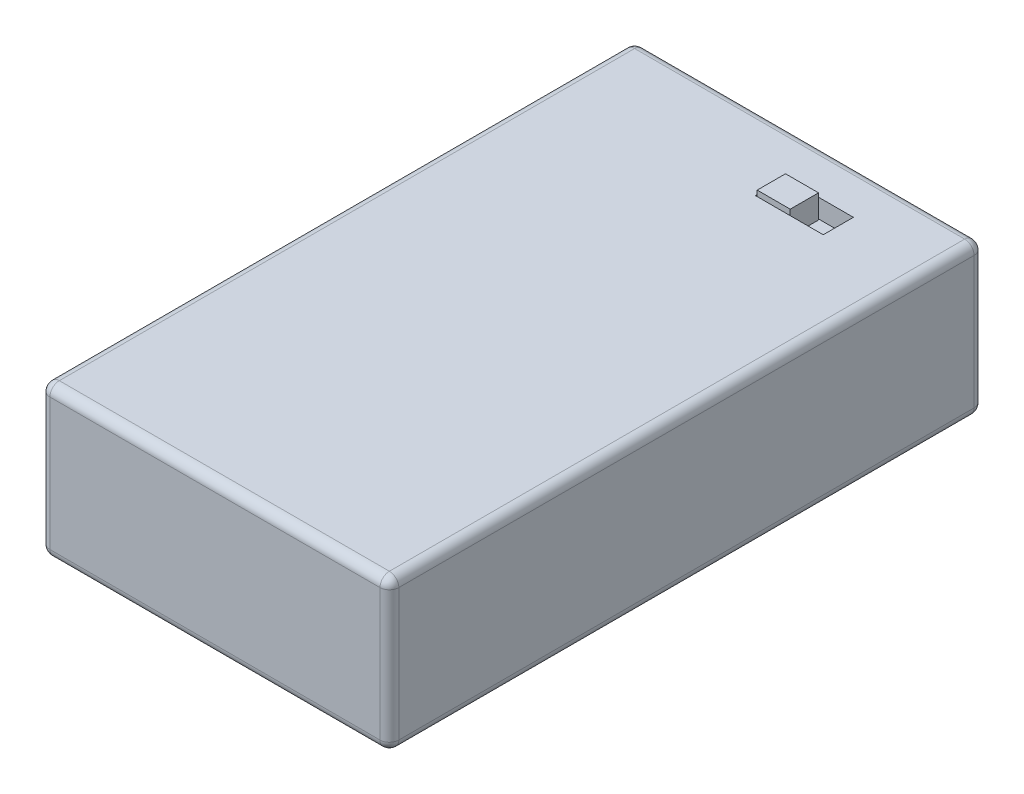
ISO-10303-21;
HEADER;
FILE_DESCRIPTION(('STEP AP214'),'2;1');
FILE_NAME('part.step','',(''),(''),'','','');
FILE_SCHEMA(('AUTOMOTIVE_DESIGN { 1 0 10303 214 1 1 1 1 }'));
ENDSEC;
DATA;
#1=APPLICATION_CONTEXT('core data for automotive mechanical design processes');
#2=APPLICATION_PROTOCOL_DEFINITION('international standard','automotive_design',2000,#1);
#3=PRODUCT_CONTEXT('',#1,'mechanical');
#4=PRODUCT('Part','Part','',(#3));
#5=PRODUCT_RELATED_PRODUCT_CATEGORY('part','',(#4));
#6=PRODUCT_DEFINITION_FORMATION('','',#4);
#7=PRODUCT_DEFINITION_CONTEXT('part definition',#1,'design');
#8=PRODUCT_DEFINITION('design','',#6,#7);
#9=PRODUCT_DEFINITION_SHAPE('','',#8);
#10=(LENGTH_UNIT() NAMED_UNIT(*) SI_UNIT(.MILLI.,.METRE.));
#11=(NAMED_UNIT(*) PLANE_ANGLE_UNIT() SI_UNIT($,.RADIAN.));
#12=(NAMED_UNIT(*) SI_UNIT($,.STERADIAN.) SOLID_ANGLE_UNIT());
#13=UNCERTAINTY_MEASURE_WITH_UNIT(LENGTH_MEASURE(1.E-05),#10,'distance_accuracy_value','');
#14=(GEOMETRIC_REPRESENTATION_CONTEXT(3) GLOBAL_UNCERTAINTY_ASSIGNED_CONTEXT((#13)) GLOBAL_UNIT_ASSIGNED_CONTEXT((#10,
#11,#12)) REPRESENTATION_CONTEXT('',''));
#15=CARTESIAN_POINT('',(0.,0.,0.));
#16=DIRECTION('',(0.,0.,1.));
#17=DIRECTION('',(1.,0.,0.));
#18=AXIS2_PLACEMENT_3D('',#15,#16,#17);
#19=CARTESIAN_POINT('',(-18.5,16.,31.5));
#20=DIRECTION('',(0.,0.,-1.));
#21=DIRECTION('',(-1.,0.,0.));
#22=AXIS2_PLACEMENT_3D('',#19,#20,#21);
#23=PLANE('',#22);
#24=DIRECTION('',(0.,-1.,0.));
#25=VECTOR('',#24,1.);
#26=CARTESIAN_POINT('',(17.5,16.,31.5));
#27=LINE('',#26,#25);
#28=CARTESIAN_POINT('',(17.5,1.,31.5));
#29=VERTEX_POINT('',#28);
#30=CARTESIAN_POINT('',(17.5,15.,31.5));
#31=VERTEX_POINT('',#30);
#32=EDGE_CURVE('E262',#29,#31,#27,.F.);
#33=ORIENTED_EDGE('',*,*,#32,.T.);
#34=DIRECTION('',(1.,0.,0.));
#35=VECTOR('',#34,1.);
#36=CARTESIAN_POINT('',(-18.5,15.,31.5));
#37=LINE('',#36,#35);
#38=CARTESIAN_POINT('',(-17.5,15.,31.5));
#39=VERTEX_POINT('',#38);
#40=EDGE_CURVE('E265',#31,#39,#37,.F.);
#41=ORIENTED_EDGE('',*,*,#40,.T.);
#42=DIRECTION('',(0.,-1.,0.));
#43=VECTOR('',#42,1.);
#44=CARTESIAN_POINT('',(-17.5,0.,31.5));
#45=LINE('',#44,#43);
#46=CARTESIAN_POINT('',(-17.5,1.,31.5));
#47=VERTEX_POINT('',#46);
#48=EDGE_CURVE('E260',#39,#47,#45,.T.);
#49=ORIENTED_EDGE('',*,*,#48,.T.);
#50=DIRECTION('',(1.,0.,0.));
#51=VECTOR('',#50,1.);
#52=CARTESIAN_POINT('',(-18.5,1.,31.5));
#53=LINE('',#52,#51);
#54=EDGE_CURVE('E258',#47,#29,#53,.T.);
#55=ORIENTED_EDGE('',*,*,#54,.T.);
#56=EDGE_LOOP('',(#33,#41,#49,#55));
#57=FACE_BOUND('',#56,.T.);
#58=ADVANCED_FACE('F35',(#57),#23,.F.);
#59=CARTESIAN_POINT('',(18.5,16.,31.5));
#60=DIRECTION('',(-1.,0.,0.));
#61=DIRECTION('',(0.,0.,1.));
#62=AXIS2_PLACEMENT_3D('',#59,#60,#61);
#63=PLANE('',#62);
#64=DIRECTION('',(0.,-1.,0.));
#65=VECTOR('',#64,1.);
#66=CARTESIAN_POINT('',(18.5,16.,30.5));
#67=LINE('',#66,#65);
#68=CARTESIAN_POINT('',(18.5,15.,30.5));
#69=VERTEX_POINT('',#68);
#70=CARTESIAN_POINT('',(18.5,1.,30.5));
#71=VERTEX_POINT('',#70);
#72=EDGE_CURVE('E251',#69,#71,#67,.T.);
#73=ORIENTED_EDGE('',*,*,#72,.T.);
#74=DIRECTION('',(0.,0.,-1.));
#75=VECTOR('',#74,1.);
#76=CARTESIAN_POINT('',(18.5,1.,31.5));
#77=LINE('',#76,#75);
#78=CARTESIAN_POINT('',(18.5,1.,-30.5));
#79=VERTEX_POINT('',#78);
#80=EDGE_CURVE('E256',#71,#79,#77,.T.);
#81=ORIENTED_EDGE('',*,*,#80,.T.);
#82=DIRECTION('',(0.,-1.,0.));
#83=VECTOR('',#82,1.);
#84=CARTESIAN_POINT('',(18.5,16.,-30.5));
#85=LINE('',#84,#83);
#86=CARTESIAN_POINT('',(18.5,15.,-30.5));
#87=VERTEX_POINT('',#86);
#88=EDGE_CURVE('E253',#79,#87,#85,.F.);
#89=ORIENTED_EDGE('',*,*,#88,.T.);
#90=DIRECTION('',(0.,0.,-1.));
#91=VECTOR('',#90,1.);
#92=CARTESIAN_POINT('',(18.5,15.,31.5));
#93=LINE('',#92,#91);
#94=EDGE_CURVE('E249',#87,#69,#93,.F.);
#95=ORIENTED_EDGE('',*,*,#94,.T.);
#96=EDGE_LOOP('',(#73,#81,#89,#95));
#97=FACE_BOUND('',#96,.T.);
#98=ADVANCED_FACE('F436',(#97),#63,.F.);
#99=CARTESIAN_POINT('',(-18.5,16.,-31.5));
#100=DIRECTION('',(0.,0.,-1.));
#101=DIRECTION('',(-1.,0.,0.));
#102=AXIS2_PLACEMENT_3D('',#99,#100,#101);
#103=PLANE('',#102);
#104=DIRECTION('',(0.,-1.,0.));
#105=VECTOR('',#104,1.);
#106=CARTESIAN_POINT('',(17.5,0.,-31.5));
#107=LINE('',#106,#105);
#108=CARTESIAN_POINT('',(17.5,15.,-31.5));
#109=VERTEX_POINT('',#108);
#110=CARTESIAN_POINT('',(17.5,1.,-31.5));
#111=VERTEX_POINT('',#110);
#112=EDGE_CURVE('E244',#109,#111,#107,.T.);
#113=ORIENTED_EDGE('',*,*,#112,.T.);
#114=DIRECTION('',(1.,0.,0.));
#115=VECTOR('',#114,1.);
#116=CARTESIAN_POINT('',(-18.5,1.,-31.5));
#117=LINE('',#116,#115);
#118=CARTESIAN_POINT('',(-17.5,1.,-31.5));
#119=VERTEX_POINT('',#118);
#120=EDGE_CURVE('E247',#111,#119,#117,.F.);
#121=ORIENTED_EDGE('',*,*,#120,.T.);
#122=DIRECTION('',(0.,-1.,0.));
#123=VECTOR('',#122,1.);
#124=CARTESIAN_POINT('',(-17.5,16.,-31.5));
#125=LINE('',#124,#123);
#126=CARTESIAN_POINT('',(-17.5,15.,-31.5));
#127=VERTEX_POINT('',#126);
#128=EDGE_CURVE('E242',#119,#127,#125,.F.);
#129=ORIENTED_EDGE('',*,*,#128,.T.);
#130=DIRECTION('',(1.,0.,0.));
#131=VECTOR('',#130,1.);
#132=CARTESIAN_POINT('',(-18.5,15.,-31.5));
#133=LINE('',#132,#131);
#134=EDGE_CURVE('E240',#127,#109,#133,.T.);
#135=ORIENTED_EDGE('',*,*,#134,.T.);
#136=EDGE_LOOP('',(#113,#121,#129,#135));
#137=FACE_BOUND('',#136,.T.);
#138=ADVANCED_FACE('F441',(#137),#103,.T.);
#139=CARTESIAN_POINT('',(-18.5,16.,31.5));
#140=DIRECTION('',(-1.,0.,0.));
#141=DIRECTION('',(0.,0.,1.));
#142=AXIS2_PLACEMENT_3D('',#139,#140,#141);
#143=PLANE('',#142);
#144=DIRECTION('',(0.,-1.,0.));
#145=VECTOR('',#144,1.);
#146=CARTESIAN_POINT('',(-18.5,16.,-30.5));
#147=LINE('',#146,#145);
#148=CARTESIAN_POINT('',(-18.5,15.,-30.5));
#149=VERTEX_POINT('',#148);
#150=CARTESIAN_POINT('',(-18.5,1.,-30.5));
#151=VERTEX_POINT('',#150);
#152=EDGE_CURVE('E271',#149,#151,#147,.T.);
#153=ORIENTED_EDGE('',*,*,#152,.T.);
#154=DIRECTION('',(0.,0.,-1.));
#155=VECTOR('',#154,1.);
#156=CARTESIAN_POINT('',(-18.5,1.,31.5));
#157=LINE('',#156,#155);
#158=CARTESIAN_POINT('',(-18.5,1.,30.5));
#159=VERTEX_POINT('',#158);
#160=EDGE_CURVE('E274',#151,#159,#157,.F.);
#161=ORIENTED_EDGE('',*,*,#160,.T.);
#162=DIRECTION('',(0.,-1.,0.));
#163=VECTOR('',#162,1.);
#164=CARTESIAN_POINT('',(-18.5,16.,30.5));
#165=LINE('',#164,#163);
#166=CARTESIAN_POINT('',(-18.5,15.,30.5));
#167=VERTEX_POINT('',#166);
#168=EDGE_CURVE('E269',#159,#167,#165,.F.);
#169=ORIENTED_EDGE('',*,*,#168,.T.);
#170=DIRECTION('',(0.,0.,-1.));
#171=VECTOR('',#170,1.);
#172=CARTESIAN_POINT('',(-18.5,15.,31.5));
#173=LINE('',#172,#171);
#174=EDGE_CURVE('E267',#167,#149,#173,.T.);
#175=ORIENTED_EDGE('',*,*,#174,.T.);
#176=EDGE_LOOP('',(#153,#161,#169,#175));
#177=FACE_BOUND('',#176,.T.);
#178=ADVANCED_FACE('F381',(#177),#143,.T.);
#179=CARTESIAN_POINT('',(0.,16.,0.));
#180=DIRECTION('',(0.,1.,0.));
#181=DIRECTION('',(0.,0.,1.));
#182=AXIS2_PLACEMENT_3D('',#179,#180,#181);
#183=PLANE('',#182);
#184=DIRECTION('',(0.,0.,-1.));
#185=VECTOR('',#184,1.);
#186=CARTESIAN_POINT('',(9.59999999999999,16.,0.));
#187=LINE('',#186,#185);
#188=CARTESIAN_POINT('',(9.59999999999999,16.,-23.4));
#189=VERTEX_POINT('',#188);
#190=CARTESIAN_POINT('',(9.59999999999999,16.,-26.6));
#191=VERTEX_POINT('',#190);
#192=EDGE_CURVE('E60',#189,#191,#187,.T.);
#193=ORIENTED_EDGE('',*,*,#192,.F.);
#194=DIRECTION('',(-1.,0.,0.));
#195=VECTOR('',#194,1.);
#196=CARTESIAN_POINT('',(0.,16.,-23.4));
#197=LINE('',#196,#195);
#198=CARTESIAN_POINT('',(2.4,16.,-23.4));
#199=VERTEX_POINT('',#198);
#200=EDGE_CURVE('E215',#189,#199,#197,.T.);
#201=ORIENTED_EDGE('',*,*,#200,.T.);
#202=DIRECTION('',(0.,0.,-1.));
#203=VECTOR('',#202,1.);
#204=CARTESIAN_POINT('',(2.4,16.,0.));
#205=LINE('',#204,#203);
#206=CARTESIAN_POINT('',(2.4,16.,-26.6));
#207=VERTEX_POINT('',#206);
#208=EDGE_CURVE('E227',#199,#207,#205,.T.);
#209=ORIENTED_EDGE('',*,*,#208,.T.);
#210=DIRECTION('',(-1.,0.,0.));
#211=VECTOR('',#210,1.);
#212=CARTESIAN_POINT('',(0.,16.,-26.6));
#213=LINE('',#212,#211);
#214=EDGE_CURVE('E224',#191,#207,#213,.T.);
#215=ORIENTED_EDGE('',*,*,#214,.F.);
#216=EDGE_LOOP('',(#193,#201,#209,#215));
#217=FACE_BOUND('',#216,.T.);
#218=DIRECTION('',(1.,0.,0.));
#219=VECTOR('',#218,1.);
#220=CARTESIAN_POINT('',(18.5,16.,30.5));
#221=LINE('',#220,#219);
#222=CARTESIAN_POINT('',(-17.5,16.,30.5));
#223=VERTEX_POINT('',#222);
#224=CARTESIAN_POINT('',(17.5,16.,30.5));
#225=VERTEX_POINT('',#224);
#226=EDGE_CURVE('E287',#223,#225,#221,.T.);
#227=ORIENTED_EDGE('',*,*,#226,.T.);
#228=DIRECTION('',(0.,0.,-1.));
#229=VECTOR('',#228,1.);
#230=CARTESIAN_POINT('',(17.5,16.,-31.5));
#231=LINE('',#230,#229);
#232=CARTESIAN_POINT('',(17.5,16.,-30.5));
#233=VERTEX_POINT('',#232);
#234=EDGE_CURVE('E11',#225,#233,#231,.T.);
#235=ORIENTED_EDGE('',*,*,#234,.T.);
#236=DIRECTION('',(1.,0.,0.));
#237=VECTOR('',#236,1.);
#238=CARTESIAN_POINT('',(0.,16.,-30.5));
#239=LINE('',#238,#237);
#240=CARTESIAN_POINT('',(-17.5,16.,-30.5));
#241=VERTEX_POINT('',#240);
#242=EDGE_CURVE('E44',#233,#241,#239,.F.);
#243=ORIENTED_EDGE('',*,*,#242,.T.);
#244=DIRECTION('',(0.,0.,-1.));
#245=VECTOR('',#244,1.);
#246=CARTESIAN_POINT('',(-17.5,16.,0.));
#247=LINE('',#246,#245);
#248=EDGE_CURVE('E285',#241,#223,#247,.F.);
#249=ORIENTED_EDGE('',*,*,#248,.T.);
#250=EDGE_LOOP('',(#227,#235,#243,#249));
#251=FACE_BOUND('',#250,.T.);
#252=ADVANCED_FACE('F372',(#217,#251),#183,.T.);
#253=CARTESIAN_POINT('',(0.,0.,0.));
#254=DIRECTION('',(0.,1.,0.));
#255=DIRECTION('',(0.,0.,1.));
#256=AXIS2_PLACEMENT_3D('',#253,#254,#255);
#257=PLANE('',#256);
#258=DIRECTION('',(1.,0.,0.));
#259=VECTOR('',#258,1.);
#260=CARTESIAN_POINT('',(18.5,0.,-30.5));
#261=LINE('',#260,#259);
#262=CARTESIAN_POINT('',(-17.5,0.,-30.5));
#263=VERTEX_POINT('',#262);
#264=CARTESIAN_POINT('',(17.5,0.,-30.5));
#265=VERTEX_POINT('',#264);
#266=EDGE_CURVE('E280',#263,#265,#261,.T.);
#267=ORIENTED_EDGE('',*,*,#266,.T.);
#268=DIRECTION('',(0.,0.,-1.));
#269=VECTOR('',#268,1.);
#270=CARTESIAN_POINT('',(17.5,0.,0.));
#271=LINE('',#270,#269);
#272=CARTESIAN_POINT('',(17.5,0.,30.5));
#273=VERTEX_POINT('',#272);
#274=EDGE_CURVE('E283',#265,#273,#271,.F.);
#275=ORIENTED_EDGE('',*,*,#274,.T.);
#276=DIRECTION('',(1.,0.,0.));
#277=VECTOR('',#276,1.);
#278=CARTESIAN_POINT('',(0.,0.,30.5));
#279=LINE('',#278,#277);
#280=CARTESIAN_POINT('',(-17.5,0.,30.5));
#281=VERTEX_POINT('',#280);
#282=EDGE_CURVE('E278',#273,#281,#279,.F.);
#283=ORIENTED_EDGE('',*,*,#282,.T.);
#284=DIRECTION('',(0.,0.,-1.));
#285=VECTOR('',#284,1.);
#286=CARTESIAN_POINT('',(-17.5,0.,-31.5));
#287=LINE('',#286,#285);
#288=EDGE_CURVE('E276',#281,#263,#287,.T.);
#289=ORIENTED_EDGE('',*,*,#288,.T.);
#290=EDGE_LOOP('',(#267,#275,#283,#289));
#291=FACE_BOUND('',#290,.T.);
#292=ADVANCED_FACE('F488',(#291),#257,.F.);
#293=CARTESIAN_POINT('',(-17.5,16.,30.5));
#294=DIRECTION('',(0.,1.,0.));
#295=DIRECTION('',(0.,0.,1.));
#296=AXIS2_PLACEMENT_3D('',#293,#294,#295);
#297=CYLINDRICAL_SURFACE('',#296,1.);
#298=CARTESIAN_POINT('',(-17.5,15.,30.5));
#299=DIRECTION('',(0.,1.,0.));
#300=DIRECTION('',(0.,0.,1.));
#301=AXIS2_PLACEMENT_3D('',#298,#299,#300);
#302=CIRCLE('',#301,1.);
#303=EDGE_CURVE('E39',#167,#39,#302,.T.);
#304=ORIENTED_EDGE('',*,*,#303,.F.);
#305=ORIENTED_EDGE('',*,*,#168,.F.);
#306=CARTESIAN_POINT('',(-17.5,1.,30.5));
#307=DIRECTION('',(0.,-1.,0.));
#308=DIRECTION('',(1.,0.,0.));
#309=AXIS2_PLACEMENT_3D('',#306,#307,#308);
#310=CIRCLE('',#309,1.);
#311=EDGE_CURVE('E349',#47,#159,#310,.T.);
#312=ORIENTED_EDGE('',*,*,#311,.F.);
#313=ORIENTED_EDGE('',*,*,#48,.F.);
#314=EDGE_LOOP('',(#304,#305,#312,#313));
#315=FACE_BOUND('',#314,.T.);
#316=ADVANCED_FACE('F37',(#315),#297,.T.);
#317=CARTESIAN_POINT('',(-17.5,15.,30.5));
#318=DIRECTION('',(0.,0.,1.));
#319=DIRECTION('',(1.,0.,0.));
#320=AXIS2_PLACEMENT_3D('',#317,#318,#319);
#321=SPHERICAL_SURFACE('',#320,1.);
#322=CARTESIAN_POINT('',(-17.5,15.,30.5));
#323=DIRECTION('',(0.,0.,1.));
#324=DIRECTION('',(1.,0.,0.));
#325=AXIS2_PLACEMENT_3D('',#322,#323,#324);
#326=CIRCLE('',#325,1.);
#327=EDGE_CURVE('E344',#167,#223,#326,.F.);
#328=ORIENTED_EDGE('',*,*,#327,.F.);
#329=ORIENTED_EDGE('',*,*,#303,.T.);
#330=CARTESIAN_POINT('',(-17.5,15.,30.5));
#331=DIRECTION('',(-1.,0.,0.));
#332=DIRECTION('',(0.,0.,1.));
#333=AXIS2_PLACEMENT_3D('',#330,#331,#332);
#334=CIRCLE('',#333,1.);
#335=EDGE_CURVE('E347',#223,#39,#334,.F.);
#336=ORIENTED_EDGE('',*,*,#335,.F.);
#337=EDGE_LOOP('',(#328,#329,#336));
#338=FACE_BOUND('',#337,.T.);
#339=ADVANCED_FACE('F360',(#338),#321,.T.);
#340=CARTESIAN_POINT('',(-17.5,1.,30.5));
#341=DIRECTION('',(-1.,0.,0.));
#342=DIRECTION('',(0.,0.,1.));
#343=AXIS2_PLACEMENT_3D('',#340,#341,#342);
#344=SPHERICAL_SURFACE('',#343,1.);
#345=CARTESIAN_POINT('',(-17.5,1.,30.5));
#346=DIRECTION('',(-1.,0.,0.));
#347=DIRECTION('',(0.,0.,1.));
#348=AXIS2_PLACEMENT_3D('',#345,#346,#347);
#349=CIRCLE('',#348,1.);
#350=EDGE_CURVE('E338',#47,#281,#349,.F.);
#351=ORIENTED_EDGE('',*,*,#350,.F.);
#352=ORIENTED_EDGE('',*,*,#311,.T.);
#353=CARTESIAN_POINT('',(-17.5,1.,30.5));
#354=DIRECTION('',(0.,0.,1.));
#355=DIRECTION('',(1.,0.,0.));
#356=AXIS2_PLACEMENT_3D('',#353,#354,#355);
#357=CIRCLE('',#356,1.);
#358=EDGE_CURVE('E341',#281,#159,#357,.F.);
#359=ORIENTED_EDGE('',*,*,#358,.F.);
#360=EDGE_LOOP('',(#351,#352,#359));
#361=FACE_BOUND('',#360,.T.);
#362=ADVANCED_FACE('F396',(#361),#344,.T.);
#363=CARTESIAN_POINT('',(0.,15.,30.5));
#364=DIRECTION('',(-1.,0.,0.));
#365=DIRECTION('',(0.,0.,1.));
#366=AXIS2_PLACEMENT_3D('',#363,#364,#365);
#367=CYLINDRICAL_SURFACE('',#366,1.);
#368=ORIENTED_EDGE('',*,*,#335,.T.);
#369=ORIENTED_EDGE('',*,*,#40,.F.);
#370=CARTESIAN_POINT('',(17.5,15.,30.5));
#371=DIRECTION('',(1.,0.,0.));
#372=DIRECTION('',(0.,0.,-1.));
#373=AXIS2_PLACEMENT_3D('',#370,#371,#372);
#374=CIRCLE('',#373,1.);
#375=EDGE_CURVE('E333',#225,#31,#374,.T.);
#376=ORIENTED_EDGE('',*,*,#375,.F.);
#377=ORIENTED_EDGE('',*,*,#226,.F.);
#378=EDGE_LOOP('',(#368,#369,#376,#377));
#379=FACE_BOUND('',#378,.T.);
#380=ADVANCED_FACE('F368',(#379),#367,.T.);
#381=CARTESIAN_POINT('',(-17.5,15.,31.5));
#382=DIRECTION('',(0.,0.,-1.));
#383=DIRECTION('',(-1.,0.,0.));
#384=AXIS2_PLACEMENT_3D('',#381,#382,#383);
#385=CYLINDRICAL_SURFACE('',#384,1.);
#386=ORIENTED_EDGE('',*,*,#327,.T.);
#387=ORIENTED_EDGE('',*,*,#248,.F.);
#388=CARTESIAN_POINT('',(-17.5,15.,-30.5));
#389=DIRECTION('',(0.,0.,-1.));
#390=DIRECTION('',(-1.,0.,0.));
#391=AXIS2_PLACEMENT_3D('',#388,#389,#390);
#392=CIRCLE('',#391,1.);
#393=EDGE_CURVE('E330',#149,#241,#392,.T.);
#394=ORIENTED_EDGE('',*,*,#393,.F.);
#395=ORIENTED_EDGE('',*,*,#174,.F.);
#396=EDGE_LOOP('',(#386,#387,#394,#395));
#397=FACE_BOUND('',#396,.T.);
#398=ADVANCED_FACE('F378',(#397),#385,.T.);
#399=CARTESIAN_POINT('',(-17.5,16.,-30.5));
#400=DIRECTION('',(0.,-1.,0.));
#401=DIRECTION('',(0.,0.,-1.));
#402=AXIS2_PLACEMENT_3D('',#399,#400,#401);
#403=CYLINDRICAL_SURFACE('',#402,1.);
#404=CARTESIAN_POINT('',(-17.5,1.,-30.5));
#405=DIRECTION('',(0.,-1.,0.));
#406=DIRECTION('',(0.,0.,-1.));
#407=AXIS2_PLACEMENT_3D('',#404,#405,#406);
#408=CIRCLE('',#407,1.);
#409=EDGE_CURVE('E324',#151,#119,#408,.T.);
#410=ORIENTED_EDGE('',*,*,#409,.F.);
#411=ORIENTED_EDGE('',*,*,#152,.F.);
#412=CARTESIAN_POINT('',(-17.5,15.,-30.5));
#413=DIRECTION('',(0.,1.,0.));
#414=DIRECTION('',(0.,0.,1.));
#415=AXIS2_PLACEMENT_3D('',#412,#413,#414);
#416=CIRCLE('',#415,1.);
#417=EDGE_CURVE('E327',#127,#149,#416,.T.);
#418=ORIENTED_EDGE('',*,*,#417,.F.);
#419=ORIENTED_EDGE('',*,*,#128,.F.);
#420=EDGE_LOOP('',(#410,#411,#418,#419));
#421=FACE_BOUND('',#420,.T.);
#422=ADVANCED_FACE('F385',(#421),#403,.T.);
#423=CARTESIAN_POINT('',(-17.5,1.,0.));
#424=DIRECTION('',(0.,0.,1.));
#425=DIRECTION('',(1.,0.,0.));
#426=AXIS2_PLACEMENT_3D('',#423,#424,#425);
#427=CYLINDRICAL_SURFACE('',#426,1.);
#428=ORIENTED_EDGE('',*,*,#358,.T.);
#429=ORIENTED_EDGE('',*,*,#160,.F.);
#430=CARTESIAN_POINT('',(-17.5,1.,-30.5));
#431=DIRECTION('',(0.,0.,-1.));
#432=DIRECTION('',(-1.,0.,0.));
#433=AXIS2_PLACEMENT_3D('',#430,#431,#432);
#434=CIRCLE('',#433,1.);
#435=EDGE_CURVE('E322',#263,#151,#434,.T.);
#436=ORIENTED_EDGE('',*,*,#435,.F.);
#437=ORIENTED_EDGE('',*,*,#288,.F.);
#438=EDGE_LOOP('',(#428,#429,#436,#437));
#439=FACE_BOUND('',#438,.T.);
#440=ADVANCED_FACE('F393',(#439),#427,.T.);
#441=CARTESIAN_POINT('',(-18.5,1.,30.5));
#442=DIRECTION('',(1.,0.,0.));
#443=DIRECTION('',(0.,0.,-1.));
#444=AXIS2_PLACEMENT_3D('',#441,#442,#443);
#445=CYLINDRICAL_SURFACE('',#444,1.);
#446=ORIENTED_EDGE('',*,*,#350,.T.);
#447=ORIENTED_EDGE('',*,*,#282,.F.);
#448=CARTESIAN_POINT('',(17.5,1.,30.5));
#449=DIRECTION('',(1.,0.,0.));
#450=DIRECTION('',(0.,0.,-1.));
#451=AXIS2_PLACEMENT_3D('',#448,#449,#450);
#452=CIRCLE('',#451,1.);
#453=EDGE_CURVE('E319',#29,#273,#452,.T.);
#454=ORIENTED_EDGE('',*,*,#453,.F.);
#455=ORIENTED_EDGE('',*,*,#54,.F.);
#456=EDGE_LOOP('',(#446,#447,#454,#455));
#457=FACE_BOUND('',#456,.T.);
#458=ADVANCED_FACE('F400',(#457),#445,.T.);
#459=CARTESIAN_POINT('',(17.5,16.,30.5));
#460=DIRECTION('',(0.,-1.,0.));
#461=DIRECTION('',(0.,0.,-1.));
#462=AXIS2_PLACEMENT_3D('',#459,#460,#461);
#463=CYLINDRICAL_SURFACE('',#462,1.);
#464=CARTESIAN_POINT('',(17.5,15.,30.5));
#465=DIRECTION('',(0.,1.,0.));
#466=DIRECTION('',(0.,0.,1.));
#467=AXIS2_PLACEMENT_3D('',#464,#465,#466);
#468=CIRCLE('',#467,1.);
#469=EDGE_CURVE('E335',#31,#69,#468,.T.);
#470=ORIENTED_EDGE('',*,*,#469,.F.);
#471=ORIENTED_EDGE('',*,*,#32,.F.);
#472=CARTESIAN_POINT('',(17.5,1.,30.5));
#473=DIRECTION('',(0.,-1.,0.));
#474=DIRECTION('',(0.,0.,-1.));
#475=AXIS2_PLACEMENT_3D('',#472,#473,#474);
#476=CIRCLE('',#475,1.);
#477=EDGE_CURVE('E316',#71,#29,#476,.T.);
#478=ORIENTED_EDGE('',*,*,#477,.F.);
#479=ORIENTED_EDGE('',*,*,#72,.F.);
#480=EDGE_LOOP('',(#470,#471,#478,#479));
#481=FACE_BOUND('',#480,.T.);
#482=ADVANCED_FACE('F406',(#481),#463,.T.);
#483=CARTESIAN_POINT('',(17.5,15.,30.5));
#484=DIRECTION('',(0.,0.,1.));
#485=DIRECTION('',(1.,0.,0.));
#486=AXIS2_PLACEMENT_3D('',#483,#484,#485);
#487=SPHERICAL_SURFACE('',#486,1.);
#488=ORIENTED_EDGE('',*,*,#375,.T.);
#489=ORIENTED_EDGE('',*,*,#469,.T.);
#490=CARTESIAN_POINT('',(17.5,15.,30.5));
#491=DIRECTION('',(0.,0.,1.));
#492=DIRECTION('',(1.,0.,0.));
#493=AXIS2_PLACEMENT_3D('',#490,#491,#492);
#494=CIRCLE('',#493,1.);
#495=EDGE_CURVE('E313',#225,#69,#494,.F.);
#496=ORIENTED_EDGE('',*,*,#495,.F.);
#497=EDGE_LOOP('',(#488,#489,#496));
#498=FACE_BOUND('',#497,.T.);
#499=ADVANCED_FACE('F410',(#498),#487,.T.);
#500=CARTESIAN_POINT('',(-17.5,15.,-30.5));
#501=DIRECTION('',(-1.,0.,0.));
#502=DIRECTION('',(0.,0.,1.));
#503=AXIS2_PLACEMENT_3D('',#500,#501,#502);
#504=SPHERICAL_SURFACE('',#503,1.);
#505=ORIENTED_EDGE('',*,*,#417,.T.);
#506=ORIENTED_EDGE('',*,*,#393,.T.);
#507=CARTESIAN_POINT('',(-17.5,15.,-30.5));
#508=DIRECTION('',(-1.,0.,0.));
#509=DIRECTION('',(0.,0.,1.));
#510=AXIS2_PLACEMENT_3D('',#507,#508,#509);
#511=CIRCLE('',#510,1.);
#512=EDGE_CURVE('E311',#127,#241,#511,.F.);
#513=ORIENTED_EDGE('',*,*,#512,.F.);
#514=EDGE_LOOP('',(#505,#506,#513));
#515=FACE_BOUND('',#514,.T.);
#516=ADVANCED_FACE('F424',(#515),#504,.T.);
#517=CARTESIAN_POINT('',(-17.5,1.,-30.5));
#518=DIRECTION('',(-1.,0.,0.));
#519=DIRECTION('',(0.,0.,1.));
#520=AXIS2_PLACEMENT_3D('',#517,#518,#519);
#521=SPHERICAL_SURFACE('',#520,1.);
#522=ORIENTED_EDGE('',*,*,#435,.T.);
#523=ORIENTED_EDGE('',*,*,#409,.T.);
#524=CARTESIAN_POINT('',(-17.5,1.,-30.5));
#525=DIRECTION('',(-1.,0.,0.));
#526=DIRECTION('',(0.,0.,1.));
#527=AXIS2_PLACEMENT_3D('',#524,#525,#526);
#528=CIRCLE('',#527,1.);
#529=EDGE_CURVE('E308',#263,#119,#528,.F.);
#530=ORIENTED_EDGE('',*,*,#529,.F.);
#531=EDGE_LOOP('',(#522,#523,#530));
#532=FACE_BOUND('',#531,.T.);
#533=ADVANCED_FACE('F426',(#532),#521,.T.);
#534=CARTESIAN_POINT('',(17.5,1.,30.5));
#535=DIRECTION('',(0.,0.,1.));
#536=DIRECTION('',(0.,-1.,0.));
#537=AXIS2_PLACEMENT_3D('',#534,#535,#536);
#538=SPHERICAL_SURFACE('',#537,1.);
#539=ORIENTED_EDGE('',*,*,#477,.T.);
#540=ORIENTED_EDGE('',*,*,#453,.T.);
#541=CARTESIAN_POINT('',(17.5,1.,30.5));
#542=DIRECTION('',(0.,0.,1.));
#543=DIRECTION('',(1.,0.,0.));
#544=AXIS2_PLACEMENT_3D('',#541,#542,#543);
#545=CIRCLE('',#544,1.);
#546=EDGE_CURVE('E305',#71,#273,#545,.F.);
#547=ORIENTED_EDGE('',*,*,#546,.F.);
#548=EDGE_LOOP('',(#539,#540,#547));
#549=FACE_BOUND('',#548,.T.);
#550=ADVANCED_FACE('F432',(#549),#538,.T.);
#551=CARTESIAN_POINT('',(17.5,15.,0.));
#552=DIRECTION('',(0.,0.,1.));
#553=DIRECTION('',(1.,0.,0.));
#554=AXIS2_PLACEMENT_3D('',#551,#552,#553);
#555=CYLINDRICAL_SURFACE('',#554,1.);
#556=ORIENTED_EDGE('',*,*,#495,.T.);
#557=ORIENTED_EDGE('',*,*,#94,.F.);
#558=CARTESIAN_POINT('',(17.5,15.,-30.5));
#559=DIRECTION('',(0.,0.,-1.));
#560=DIRECTION('',(-1.,0.,0.));
#561=AXIS2_PLACEMENT_3D('',#558,#559,#560);
#562=CIRCLE('',#561,1.);
#563=EDGE_CURVE('E302',#233,#87,#562,.T.);
#564=ORIENTED_EDGE('',*,*,#563,.F.);
#565=ORIENTED_EDGE('',*,*,#234,.F.);
#566=EDGE_LOOP('',(#556,#557,#564,#565));
#567=FACE_BOUND('',#566,.T.);
#568=ADVANCED_FACE('F413',(#567),#555,.T.);
#569=CARTESIAN_POINT('',(-18.5,15.,-30.5));
#570=DIRECTION('',(1.,0.,0.));
#571=DIRECTION('',(0.,0.,-1.));
#572=AXIS2_PLACEMENT_3D('',#569,#570,#571);
#573=CYLINDRICAL_SURFACE('',#572,1.);
#574=ORIENTED_EDGE('',*,*,#512,.T.);
#575=ORIENTED_EDGE('',*,*,#242,.F.);
#576=CARTESIAN_POINT('',(17.5,15.,-30.5));
#577=DIRECTION('',(1.,0.,0.));
#578=DIRECTION('',(0.,0.,-1.));
#579=AXIS2_PLACEMENT_3D('',#576,#577,#578);
#580=CIRCLE('',#579,1.);
#581=EDGE_CURVE('E299',#109,#233,#580,.T.);
#582=ORIENTED_EDGE('',*,*,#581,.F.);
#583=ORIENTED_EDGE('',*,*,#134,.F.);
#584=EDGE_LOOP('',(#574,#575,#582,#583));
#585=FACE_BOUND('',#584,.T.);
#586=ADVANCED_FACE('F422',(#585),#573,.T.);
#587=CARTESIAN_POINT('',(0.,1.,-30.5));
#588=DIRECTION('',(-1.,0.,0.));
#589=DIRECTION('',(0.,0.,1.));
#590=AXIS2_PLACEMENT_3D('',#587,#588,#589);
#591=CYLINDRICAL_SURFACE('',#590,1.);
#592=ORIENTED_EDGE('',*,*,#529,.T.);
#593=ORIENTED_EDGE('',*,*,#120,.F.);
#594=CARTESIAN_POINT('',(17.5,1.,-30.5));
#595=DIRECTION('',(1.,0.,0.));
#596=DIRECTION('',(0.,0.,-1.));
#597=AXIS2_PLACEMENT_3D('',#594,#595,#596);
#598=CIRCLE('',#597,1.);
#599=EDGE_CURVE('E296',#265,#111,#598,.T.);
#600=ORIENTED_EDGE('',*,*,#599,.F.);
#601=ORIENTED_EDGE('',*,*,#266,.F.);
#602=EDGE_LOOP('',(#592,#593,#600,#601));
#603=FACE_BOUND('',#602,.T.);
#604=ADVANCED_FACE('F460',(#603),#591,.T.);
#605=CARTESIAN_POINT('',(17.5,1.,31.5));
#606=DIRECTION('',(0.,0.,-1.));
#607=DIRECTION('',(-1.,0.,0.));
#608=AXIS2_PLACEMENT_3D('',#605,#606,#607);
#609=CYLINDRICAL_SURFACE('',#608,1.);
#610=ORIENTED_EDGE('',*,*,#546,.T.);
#611=ORIENTED_EDGE('',*,*,#274,.F.);
#612=CARTESIAN_POINT('',(17.5,1.,-30.5));
#613=DIRECTION('',(0.,0.,-1.));
#614=DIRECTION('',(-1.,0.,0.));
#615=AXIS2_PLACEMENT_3D('',#612,#613,#614);
#616=CIRCLE('',#615,1.);
#617=EDGE_CURVE('E294',#79,#265,#616,.T.);
#618=ORIENTED_EDGE('',*,*,#617,.F.);
#619=ORIENTED_EDGE('',*,*,#80,.F.);
#620=EDGE_LOOP('',(#610,#611,#618,#619));
#621=FACE_BOUND('',#620,.T.);
#622=ADVANCED_FACE('F457',(#621),#609,.T.);
#623=CARTESIAN_POINT('',(17.5,15.,-30.5));
#624=DIRECTION('',(0.,1.,0.));
#625=DIRECTION('',(0.,0.,1.));
#626=AXIS2_PLACEMENT_3D('',#623,#624,#625);
#627=SPHERICAL_SURFACE('',#626,1.);
#628=ORIENTED_EDGE('',*,*,#581,.T.);
#629=ORIENTED_EDGE('',*,*,#563,.T.);
#630=CARTESIAN_POINT('',(17.5,15.,-30.5));
#631=DIRECTION('',(0.,1.,0.));
#632=DIRECTION('',(0.,0.,1.));
#633=AXIS2_PLACEMENT_3D('',#630,#631,#632);
#634=CIRCLE('',#633,1.);
#635=EDGE_CURVE('E292',#109,#87,#634,.F.);
#636=ORIENTED_EDGE('',*,*,#635,.F.);
#637=EDGE_LOOP('',(#628,#629,#636));
#638=FACE_BOUND('',#637,.T.);
#639=ADVANCED_FACE('F418',(#638),#627,.T.);
#640=CARTESIAN_POINT('',(17.5,1.,-30.5));
#641=DIRECTION('',(0.,-1.,0.));
#642=DIRECTION('',(0.,0.,-1.));
#643=AXIS2_PLACEMENT_3D('',#640,#641,#642);
#644=SPHERICAL_SURFACE('',#643,1.);
#645=ORIENTED_EDGE('',*,*,#617,.T.);
#646=ORIENTED_EDGE('',*,*,#599,.T.);
#647=CARTESIAN_POINT('',(17.5,1.,-30.5));
#648=DIRECTION('',(0.,-1.,0.));
#649=DIRECTION('',(1.,0.,0.));
#650=AXIS2_PLACEMENT_3D('',#647,#648,#649);
#651=CIRCLE('',#650,1.);
#652=EDGE_CURVE('E234',#79,#111,#651,.F.);
#653=ORIENTED_EDGE('',*,*,#652,.F.);
#654=EDGE_LOOP('',(#645,#646,#653));
#655=FACE_BOUND('',#654,.T.);
#656=ADVANCED_FACE('F450',(#655),#644,.T.);
#657=CARTESIAN_POINT('',(17.5,16.,-30.5));
#658=DIRECTION('',(0.,1.,0.));
#659=DIRECTION('',(0.,0.,1.));
#660=AXIS2_PLACEMENT_3D('',#657,#658,#659);
#661=CYLINDRICAL_SURFACE('',#660,1.);
#662=ORIENTED_EDGE('',*,*,#635,.T.);
#663=ORIENTED_EDGE('',*,*,#88,.F.);
#664=ORIENTED_EDGE('',*,*,#652,.T.);
#665=ORIENTED_EDGE('',*,*,#112,.F.);
#666=EDGE_LOOP('',(#662,#663,#664,#665));
#667=FACE_BOUND('',#666,.T.);
#668=ADVANCED_FACE('F446',(#667),#661,.T.);
#669=CARTESIAN_POINT('',(9.59999999999999,14.,0.));
#670=DIRECTION('',(1.,0.,0.));
#671=DIRECTION('',(0.,0.,-1.));
#672=AXIS2_PLACEMENT_3D('',#669,#670,#671);
#673=PLANE('',#672);
#674=ORIENTED_EDGE('',*,*,#192,.T.);
#675=DIRECTION('',(0.,1.,0.));
#676=VECTOR('',#675,1.);
#677=CARTESIAN_POINT('',(9.59999999999999,14.,-26.6));
#678=LINE('',#677,#676);
#679=CARTESIAN_POINT('',(9.59999999999999,14.,-26.6));
#680=VERTEX_POINT('',#679);
#681=EDGE_CURVE('E222',#680,#191,#678,.T.);
#682=ORIENTED_EDGE('',*,*,#681,.F.);
#683=DIRECTION('',(0.,0.,-1.));
#684=VECTOR('',#683,1.);
#685=CARTESIAN_POINT('',(9.59999999999999,14.,0.));
#686=LINE('',#685,#684);
#687=CARTESIAN_POINT('',(9.59999999999999,14.,-23.4));
#688=VERTEX_POINT('',#687);
#689=EDGE_CURVE('E211',#688,#680,#686,.T.);
#690=ORIENTED_EDGE('',*,*,#689,.F.);
#691=DIRECTION('',(0.,1.,0.));
#692=VECTOR('',#691,1.);
#693=CARTESIAN_POINT('',(9.59999999999999,14.,-23.4));
#694=LINE('',#693,#692);
#695=EDGE_CURVE('E232',#688,#189,#694,.T.);
#696=ORIENTED_EDGE('',*,*,#695,.T.);
#697=EDGE_LOOP('',(#674,#682,#690,#696));
#698=FACE_BOUND('',#697,.T.);
#699=ADVANCED_FACE('F449',(#698),#673,.F.);
#700=CARTESIAN_POINT('',(0.,14.,-23.4));
#701=DIRECTION('',(0.,0.,-1.));
#702=DIRECTION('',(-1.,0.,0.));
#703=AXIS2_PLACEMENT_3D('',#700,#701,#702);
#704=PLANE('',#703);
#705=ORIENTED_EDGE('',*,*,#200,.F.);
#706=ORIENTED_EDGE('',*,*,#695,.F.);
#707=DIRECTION('',(-1.,0.,0.));
#708=VECTOR('',#707,1.);
#709=CARTESIAN_POINT('',(0.,14.,-23.4));
#710=LINE('',#709,#708);
#711=CARTESIAN_POINT('',(2.4,14.,-23.4));
#712=VERTEX_POINT('',#711);
#713=EDGE_CURVE('E220',#688,#712,#710,.T.);
#714=ORIENTED_EDGE('',*,*,#713,.T.);
#715=DIRECTION('',(0.,1.,0.));
#716=VECTOR('',#715,1.);
#717=CARTESIAN_POINT('',(2.4,14.,-23.4));
#718=LINE('',#717,#716);
#719=EDGE_CURVE('E235',#712,#199,#718,.T.);
#720=ORIENTED_EDGE('',*,*,#719,.T.);
#721=EDGE_LOOP('',(#705,#706,#714,#720));
#722=FACE_BOUND('',#721,.T.);
#723=ADVANCED_FACE('F497',(#722),#704,.T.);
#724=CARTESIAN_POINT('',(2.4,14.,0.));
#725=DIRECTION('',(1.,0.,0.));
#726=DIRECTION('',(0.,0.,-1.));
#727=AXIS2_PLACEMENT_3D('',#724,#725,#726);
#728=PLANE('',#727);
#729=ORIENTED_EDGE('',*,*,#208,.F.);
#730=ORIENTED_EDGE('',*,*,#719,.F.);
#731=DIRECTION('',(0.,0.,-1.));
#732=VECTOR('',#731,1.);
#733=CARTESIAN_POINT('',(2.4,14.,0.));
#734=LINE('',#733,#732);
#735=CARTESIAN_POINT('',(2.4,14.,-26.6));
#736=VERTEX_POINT('',#735);
#737=EDGE_CURVE('E218',#712,#736,#734,.T.);
#738=ORIENTED_EDGE('',*,*,#737,.T.);
#739=DIRECTION('',(0.,1.,0.));
#740=VECTOR('',#739,1.);
#741=CARTESIAN_POINT('',(2.4,14.,-26.6));
#742=LINE('',#741,#740);
#743=EDGE_CURVE('E237',#736,#207,#742,.T.);
#744=ORIENTED_EDGE('',*,*,#743,.T.);
#745=EDGE_LOOP('',(#729,#730,#738,#744));
#746=FACE_BOUND('',#745,.T.);
#747=ADVANCED_FACE('F502',(#746),#728,.T.);
#748=CARTESIAN_POINT('',(0.,14.,-26.6));
#749=DIRECTION('',(0.,0.,-1.));
#750=DIRECTION('',(-1.,0.,0.));
#751=AXIS2_PLACEMENT_3D('',#748,#749,#750);
#752=PLANE('',#751);
#753=ORIENTED_EDGE('',*,*,#214,.T.);
#754=ORIENTED_EDGE('',*,*,#743,.F.);
#755=DIRECTION('',(-1.,0.,0.));
#756=VECTOR('',#755,1.);
#757=CARTESIAN_POINT('',(0.,14.,-26.6));
#758=LINE('',#757,#756);
#759=EDGE_CURVE('E214',#680,#736,#758,.T.);
#760=ORIENTED_EDGE('',*,*,#759,.F.);
#761=ORIENTED_EDGE('',*,*,#681,.T.);
#762=EDGE_LOOP('',(#753,#754,#760,#761));
#763=FACE_BOUND('',#762,.T.);
#764=ADVANCED_FACE('F498',(#763),#752,.F.);
#765=CARTESIAN_POINT('',(0.,14.,0.));
#766=DIRECTION('',(0.,1.,0.));
#767=DIRECTION('',(0.,0.,1.));
#768=AXIS2_PLACEMENT_3D('',#765,#766,#767);
#769=PLANE('',#768);
#770=DIRECTION('',(0.,0.,-1.));
#771=VECTOR('',#770,1.);
#772=CARTESIAN_POINT('',(2.49999999999999,14.,0.));
#773=LINE('',#772,#771);
#774=CARTESIAN_POINT('',(2.49999999999999,14.,-23.5));
#775=VERTEX_POINT('',#774);
#776=CARTESIAN_POINT('',(2.49999999999999,14.,-26.5));
#777=VERTEX_POINT('',#776);
#778=EDGE_CURVE('E203',#775,#777,#773,.T.);
#779=ORIENTED_EDGE('',*,*,#778,.T.);
#780=DIRECTION('',(-1.,0.,0.));
#781=VECTOR('',#780,1.);
#782=CARTESIAN_POINT('',(0.,14.,-26.5));
#783=LINE('',#782,#781);
#784=CARTESIAN_POINT('',(6.,14.,-26.5));
#785=VERTEX_POINT('',#784);
#786=EDGE_CURVE('E187',#785,#777,#783,.T.);
#787=ORIENTED_EDGE('',*,*,#786,.F.);
#788=DIRECTION('',(0.,0.,-1.));
#789=VECTOR('',#788,1.);
#790=CARTESIAN_POINT('',(6.,14.,0.));
#791=LINE('',#790,#789);
#792=CARTESIAN_POINT('',(6.,14.,-23.5));
#793=VERTEX_POINT('',#792);
#794=EDGE_CURVE('E198',#793,#785,#791,.T.);
#795=ORIENTED_EDGE('',*,*,#794,.F.);
#796=DIRECTION('',(-1.,0.,0.));
#797=VECTOR('',#796,1.);
#798=CARTESIAN_POINT('',(0.,14.,-23.5));
#799=LINE('',#798,#797);
#800=EDGE_CURVE('E195',#793,#775,#799,.T.);
#801=ORIENTED_EDGE('',*,*,#800,.T.);
#802=EDGE_LOOP('',(#779,#787,#795,#801));
#803=FACE_BOUND('',#802,.T.);
#804=ORIENTED_EDGE('',*,*,#689,.T.);
#805=ORIENTED_EDGE('',*,*,#759,.T.);
#806=ORIENTED_EDGE('',*,*,#737,.F.);
#807=ORIENTED_EDGE('',*,*,#713,.F.);
#808=EDGE_LOOP('',(#804,#805,#806,#807));
#809=FACE_BOUND('',#808,.T.);
#810=ADVANCED_FACE('F501',(#803,#809),#769,.T.);
#811=CARTESIAN_POINT('',(2.49999999999999,16.5,0.));
#812=DIRECTION('',(-1.,0.,0.));
#813=DIRECTION('',(0.,0.,1.));
#814=AXIS2_PLACEMENT_3D('',#811,#812,#813);
#815=PLANE('',#814);
#816=ORIENTED_EDGE('',*,*,#778,.F.);
#817=DIRECTION('',(0.,-1.,0.));
#818=VECTOR('',#817,1.);
#819=CARTESIAN_POINT('',(2.49999999999999,16.5,-23.5));
#820=LINE('',#819,#818);
#821=CARTESIAN_POINT('',(2.49999999999999,16.5,-23.5));
#822=VERTEX_POINT('',#821);
#823=EDGE_CURVE('E194',#822,#775,#820,.T.);
#824=ORIENTED_EDGE('',*,*,#823,.F.);
#825=DIRECTION('',(0.,0.,-1.));
#826=VECTOR('',#825,1.);
#827=CARTESIAN_POINT('',(2.49999999999999,16.5,0.));
#828=LINE('',#827,#826);
#829=CARTESIAN_POINT('',(2.49999999999999,16.5,-26.5));
#830=VERTEX_POINT('',#829);
#831=EDGE_CURVE('E179',#822,#830,#828,.T.);
#832=ORIENTED_EDGE('',*,*,#831,.T.);
#833=DIRECTION('',(0.,-1.,0.));
#834=VECTOR('',#833,1.);
#835=CARTESIAN_POINT('',(2.49999999999999,16.5,-26.5));
#836=LINE('',#835,#834);
#837=EDGE_CURVE('E184',#830,#777,#836,.T.);
#838=ORIENTED_EDGE('',*,*,#837,.T.);
#839=EDGE_LOOP('',(#816,#824,#832,#838));
#840=FACE_BOUND('',#839,.T.);
#841=ADVANCED_FACE('F193',(#840),#815,.T.);
#842=CARTESIAN_POINT('',(0.,16.5,-23.5));
#843=DIRECTION('',(0.,0.,1.));
#844=DIRECTION('',(1.,0.,0.));
#845=AXIS2_PLACEMENT_3D('',#842,#843,#844);
#846=PLANE('',#845);
#847=ORIENTED_EDGE('',*,*,#800,.F.);
#848=DIRECTION('',(0.,-1.,0.));
#849=VECTOR('',#848,1.);
#850=CARTESIAN_POINT('',(6.,16.5,-23.5));
#851=LINE('',#850,#849);
#852=CARTESIAN_POINT('',(6.,16.5,-23.5));
#853=VERTEX_POINT('',#852);
#854=EDGE_CURVE('E208',#853,#793,#851,.T.);
#855=ORIENTED_EDGE('',*,*,#854,.F.);
#856=DIRECTION('',(-1.,0.,0.));
#857=VECTOR('',#856,1.);
#858=CARTESIAN_POINT('',(0.,16.5,-23.5));
#859=LINE('',#858,#857);
#860=EDGE_CURVE('E191',#853,#822,#859,.T.);
#861=ORIENTED_EDGE('',*,*,#860,.T.);
#862=ORIENTED_EDGE('',*,*,#823,.T.);
#863=EDGE_LOOP('',(#847,#855,#861,#862));
#864=FACE_BOUND('',#863,.T.);
#865=ADVANCED_FACE('F515',(#864),#846,.T.);
#866=CARTESIAN_POINT('',(6.,16.5,0.));
#867=DIRECTION('',(-1.,0.,0.));
#868=DIRECTION('',(0.,0.,1.));
#869=AXIS2_PLACEMENT_3D('',#866,#867,#868);
#870=PLANE('',#869);
#871=ORIENTED_EDGE('',*,*,#794,.T.);
#872=DIRECTION('',(0.,-1.,0.));
#873=VECTOR('',#872,1.);
#874=CARTESIAN_POINT('',(6.,16.5,-26.5));
#875=LINE('',#874,#873);
#876=CARTESIAN_POINT('',(6.,16.5,-26.5));
#877=VERTEX_POINT('',#876);
#878=EDGE_CURVE('E52',#877,#785,#875,.T.);
#879=ORIENTED_EDGE('',*,*,#878,.F.);
#880=DIRECTION('',(0.,0.,-1.));
#881=VECTOR('',#880,1.);
#882=CARTESIAN_POINT('',(6.,16.5,0.));
#883=LINE('',#882,#881);
#884=EDGE_CURVE('E182',#853,#877,#883,.T.);
#885=ORIENTED_EDGE('',*,*,#884,.F.);
#886=ORIENTED_EDGE('',*,*,#854,.T.);
#887=EDGE_LOOP('',(#871,#879,#885,#886));
#888=FACE_BOUND('',#887,.T.);
#889=ADVANCED_FACE('F518',(#888),#870,.F.);
#890=CARTESIAN_POINT('',(0.,16.5,-26.5));
#891=DIRECTION('',(0.,0.,1.));
#892=DIRECTION('',(1.,0.,0.));
#893=AXIS2_PLACEMENT_3D('',#890,#891,#892);
#894=PLANE('',#893);
#895=ORIENTED_EDGE('',*,*,#786,.T.);
#896=ORIENTED_EDGE('',*,*,#837,.F.);
#897=DIRECTION('',(-1.,0.,0.));
#898=VECTOR('',#897,1.);
#899=CARTESIAN_POINT('',(0.,16.5,-26.5));
#900=LINE('',#899,#898);
#901=EDGE_CURVE('E174',#877,#830,#900,.T.);
#902=ORIENTED_EDGE('',*,*,#901,.F.);
#903=ORIENTED_EDGE('',*,*,#878,.T.);
#904=EDGE_LOOP('',(#895,#896,#902,#903));
#905=FACE_BOUND('',#904,.T.);
#906=ADVANCED_FACE('F185',(#905),#894,.F.);
#907=CARTESIAN_POINT('',(0.,16.5,0.));
#908=DIRECTION('',(0.,1.,0.));
#909=DIRECTION('',(0.,0.,1.));
#910=AXIS2_PLACEMENT_3D('',#907,#908,#909);
#911=PLANE('',#910);
#912=ORIENTED_EDGE('',*,*,#831,.F.);
#913=ORIENTED_EDGE('',*,*,#860,.F.);
#914=ORIENTED_EDGE('',*,*,#884,.T.);
#915=ORIENTED_EDGE('',*,*,#901,.T.);
#916=EDGE_LOOP('',(#912,#913,#914,#915));
#917=FACE_BOUND('',#916,.T.);
#918=ADVANCED_FACE('F176',(#917),#911,.T.);
#919=CLOSED_SHELL('',(#58,#98,#138,#178,#252,#292,#316,#339,#362,#380,#398,#422,#440,#458,#482,
#499,#516,#533,#550,#568,#586,#604,#622,#639,#656,#668,#699,#723,#747,#764,#810,#841,#865,#889,
#906,#918));
#920=MANIFOLD_SOLID_BREP('B2',#919);
#921=ADVANCED_BREP_SHAPE_REPRESENTATION('',(#18,#920),#14);
#922=SHAPE_DEFINITION_REPRESENTATION(#9,#921);
ENDSEC;
END-ISO-10303-21;
